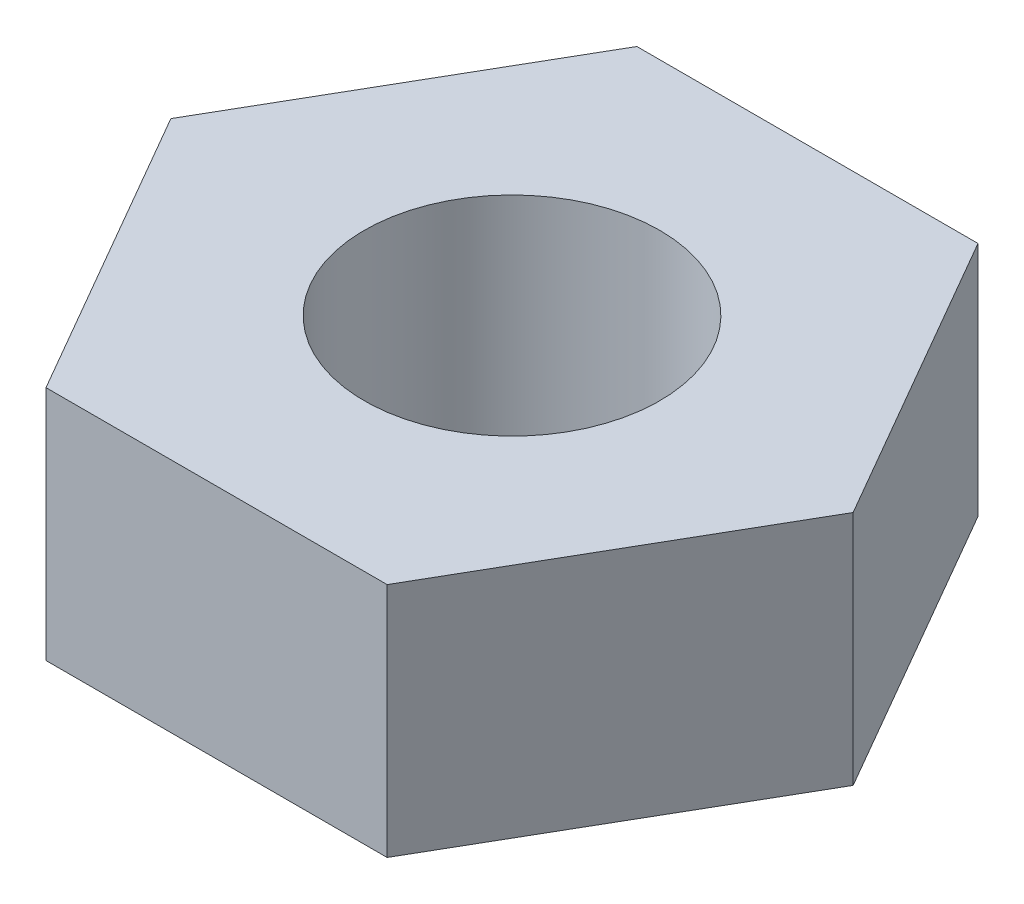
ISO-10303-21;
HEADER;
FILE_DESCRIPTION(('STEP AP214'),'2;1');
FILE_NAME('part.step','',(''),(''),'','','');
FILE_SCHEMA(('AUTOMOTIVE_DESIGN { 1 0 10303 214 1 1 1 1 }'));
ENDSEC;
DATA;
#1=APPLICATION_CONTEXT('core data for automotive mechanical design processes');
#2=APPLICATION_PROTOCOL_DEFINITION('international standard','automotive_design',2000,#1);
#3=PRODUCT_CONTEXT('',#1,'mechanical');
#4=PRODUCT('Part','Part','',(#3));
#5=PRODUCT_RELATED_PRODUCT_CATEGORY('part','',(#4));
#6=PRODUCT_DEFINITION_FORMATION('','',#4);
#7=PRODUCT_DEFINITION_CONTEXT('part definition',#1,'design');
#8=PRODUCT_DEFINITION('design','',#6,#7);
#9=PRODUCT_DEFINITION_SHAPE('','',#8);
#10=(LENGTH_UNIT() NAMED_UNIT(*) SI_UNIT(.MILLI.,.METRE.));
#11=(NAMED_UNIT(*) PLANE_ANGLE_UNIT() SI_UNIT($,.RADIAN.));
#12=(NAMED_UNIT(*) SI_UNIT($,.STERADIAN.) SOLID_ANGLE_UNIT());
#13=UNCERTAINTY_MEASURE_WITH_UNIT(LENGTH_MEASURE(1.E-05),#10,'distance_accuracy_value','');
#14=(GEOMETRIC_REPRESENTATION_CONTEXT(3) GLOBAL_UNCERTAINTY_ASSIGNED_CONTEXT((#13)) GLOBAL_UNIT_ASSIGNED_CONTEXT((#10,
#11,#12)) REPRESENTATION_CONTEXT('',''));
#15=CARTESIAN_POINT('',(0.,0.,0.));
#16=DIRECTION('',(0.,0.,1.));
#17=DIRECTION('',(1.,0.,0.));
#18=AXIS2_PLACEMENT_3D('',#15,#16,#17);
#19=CARTESIAN_POINT('',(1.44337567297407,2.,2.5));
#20=DIRECTION('',(-0.866025403784439,0.,-0.5));
#21=DIRECTION('',(-0.5,0.,0.866025403784439));
#22=AXIS2_PLACEMENT_3D('',#19,#20,#21);
#23=PLANE('',#22);
#24=DIRECTION('',(0.5,0.,-0.866025403784438));
#25=VECTOR('',#24,1.);
#26=CARTESIAN_POINT('',(1.44337567297407,0.,2.5));
#27=LINE('',#26,#25);
#28=CARTESIAN_POINT('',(1.44337567297407,0.,2.5));
#29=VERTEX_POINT('',#28);
#30=CARTESIAN_POINT('',(2.88675134594813,0.,0.));
#31=VERTEX_POINT('',#30);
#32=EDGE_CURVE('E124',#29,#31,#27,.T.);
#33=ORIENTED_EDGE('',*,*,#32,.T.);
#34=DIRECTION('',(0.,-1.,0.));
#35=VECTOR('',#34,1.);
#36=CARTESIAN_POINT('',(2.88675134594813,2.,0.));
#37=LINE('',#36,#35);
#38=CARTESIAN_POINT('',(2.88675134594813,2.,0.));
#39=VERTEX_POINT('',#38);
#40=EDGE_CURVE('E11',#39,#31,#37,.T.);
#41=ORIENTED_EDGE('',*,*,#40,.F.);
#42=DIRECTION('',(0.5,0.,-0.866025403784438));
#43=VECTOR('',#42,1.);
#44=CARTESIAN_POINT('',(1.44337567297407,2.,2.5));
#45=LINE('',#44,#43);
#46=CARTESIAN_POINT('',(1.44337567297407,2.,2.5));
#47=VERTEX_POINT('',#46);
#48=EDGE_CURVE('E135',#47,#39,#45,.T.);
#49=ORIENTED_EDGE('',*,*,#48,.F.);
#50=DIRECTION('',(0.,-1.,0.));
#51=VECTOR('',#50,1.);
#52=CARTESIAN_POINT('',(1.44337567297407,2.,2.5));
#53=LINE('',#52,#51);
#54=EDGE_CURVE('E120',#47,#29,#53,.T.);
#55=ORIENTED_EDGE('',*,*,#54,.T.);
#56=EDGE_LOOP('',(#33,#41,#49,#55));
#57=FACE_BOUND('',#56,.T.);
#58=ADVANCED_FACE('F40',(#57),#23,.F.);
#59=CARTESIAN_POINT('',(2.88675134594813,2.,0.));
#60=DIRECTION('',(-0.866025403784439,0.,0.5));
#61=DIRECTION('',(0.5,0.,0.866025403784439));
#62=AXIS2_PLACEMENT_3D('',#59,#60,#61);
#63=PLANE('',#62);
#64=DIRECTION('',(-0.5,0.,-0.866025403784438));
#65=VECTOR('',#64,1.);
#66=CARTESIAN_POINT('',(2.88675134594813,0.,0.));
#67=LINE('',#66,#65);
#68=CARTESIAN_POINT('',(1.44337567297406,0.,-2.5));
#69=VERTEX_POINT('',#68);
#70=EDGE_CURVE('E127',#31,#69,#67,.T.);
#71=ORIENTED_EDGE('',*,*,#70,.T.);
#72=DIRECTION('',(0.,-1.,0.));
#73=VECTOR('',#72,1.);
#74=CARTESIAN_POINT('',(1.44337567297406,2.,-2.5));
#75=LINE('',#74,#73);
#76=CARTESIAN_POINT('',(1.44337567297406,2.,-2.5));
#77=VERTEX_POINT('',#76);
#78=EDGE_CURVE('E48',#77,#69,#75,.T.);
#79=ORIENTED_EDGE('',*,*,#78,.F.);
#80=DIRECTION('',(-0.5,0.,-0.866025403784438));
#81=VECTOR('',#80,1.);
#82=CARTESIAN_POINT('',(2.88675134594813,2.,0.));
#83=LINE('',#82,#81);
#84=EDGE_CURVE('E93',#39,#77,#83,.T.);
#85=ORIENTED_EDGE('',*,*,#84,.F.);
#86=ORIENTED_EDGE('',*,*,#40,.T.);
#87=EDGE_LOOP('',(#71,#79,#85,#86));
#88=FACE_BOUND('',#87,.T.);
#89=ADVANCED_FACE('F160',(#88),#63,.F.);
#90=CARTESIAN_POINT('',(1.44337567297406,2.,-2.5));
#91=DIRECTION('',(0.,0.,1.));
#92=DIRECTION('',(1.,0.,0.));
#93=AXIS2_PLACEMENT_3D('',#90,#91,#92);
#94=PLANE('',#93);
#95=DIRECTION('',(-1.,0.,0.));
#96=VECTOR('',#95,1.);
#97=CARTESIAN_POINT('',(1.44337567297406,0.,-2.5));
#98=LINE('',#97,#96);
#99=CARTESIAN_POINT('',(-1.44337567297406,0.,-2.5));
#100=VERTEX_POINT('',#99);
#101=EDGE_CURVE('E130',#69,#100,#98,.T.);
#102=ORIENTED_EDGE('',*,*,#101,.T.);
#103=DIRECTION('',(0.,-1.,0.));
#104=VECTOR('',#103,1.);
#105=CARTESIAN_POINT('',(-1.44337567297406,2.,-2.5));
#106=LINE('',#105,#104);
#107=CARTESIAN_POINT('',(-1.44337567297406,2.,-2.5));
#108=VERTEX_POINT('',#107);
#109=EDGE_CURVE('E115',#108,#100,#106,.T.);
#110=ORIENTED_EDGE('',*,*,#109,.F.);
#111=DIRECTION('',(-1.,0.,0.));
#112=VECTOR('',#111,1.);
#113=CARTESIAN_POINT('',(1.44337567297406,2.,-2.5));
#114=LINE('',#113,#112);
#115=EDGE_CURVE('E106',#77,#108,#114,.T.);
#116=ORIENTED_EDGE('',*,*,#115,.F.);
#117=ORIENTED_EDGE('',*,*,#78,.T.);
#118=EDGE_LOOP('',(#102,#110,#116,#117));
#119=FACE_BOUND('',#118,.T.);
#120=ADVANCED_FACE('F141',(#119),#94,.F.);
#121=CARTESIAN_POINT('',(-1.44337567297406,2.,-2.5));
#122=DIRECTION('',(0.866025403784439,0.,0.5));
#123=DIRECTION('',(0.5,0.,-0.866025403784439));
#124=AXIS2_PLACEMENT_3D('',#121,#122,#123);
#125=PLANE('',#124);
#126=DIRECTION('',(-0.5,0.,0.866025403784439));
#127=VECTOR('',#126,1.);
#128=CARTESIAN_POINT('',(-1.44337567297406,0.,-2.5));
#129=LINE('',#128,#127);
#130=CARTESIAN_POINT('',(-2.88675134594813,0.,0.));
#131=VERTEX_POINT('',#130);
#132=EDGE_CURVE('E114',#100,#131,#129,.T.);
#133=ORIENTED_EDGE('',*,*,#132,.T.);
#134=DIRECTION('',(0.,-1.,0.));
#135=VECTOR('',#134,1.);
#136=CARTESIAN_POINT('',(-2.88675134594813,2.,0.));
#137=LINE('',#136,#135);
#138=CARTESIAN_POINT('',(-2.88675134594813,2.,0.));
#139=VERTEX_POINT('',#138);
#140=EDGE_CURVE('E111',#139,#131,#137,.T.);
#141=ORIENTED_EDGE('',*,*,#140,.F.);
#142=DIRECTION('',(-0.5,0.,0.866025403784439));
#143=VECTOR('',#142,1.);
#144=CARTESIAN_POINT('',(-1.44337567297406,2.,-2.5));
#145=LINE('',#144,#143);
#146=EDGE_CURVE('E100',#108,#139,#145,.T.);
#147=ORIENTED_EDGE('',*,*,#146,.F.);
#148=ORIENTED_EDGE('',*,*,#109,.T.);
#149=EDGE_LOOP('',(#133,#141,#147,#148));
#150=FACE_BOUND('',#149,.T.);
#151=ADVANCED_FACE('F112',(#150),#125,.F.);
#152=CARTESIAN_POINT('',(-2.88675134594813,2.,0.));
#153=DIRECTION('',(0.866025403784438,0.,-0.5));
#154=DIRECTION('',(-0.5,0.,-0.866025403784438));
#155=AXIS2_PLACEMENT_3D('',#152,#153,#154);
#156=PLANE('',#155);
#157=DIRECTION('',(0.5,0.,0.866025403784438));
#158=VECTOR('',#157,1.);
#159=CARTESIAN_POINT('',(-2.88675134594813,0.,0.));
#160=LINE('',#159,#158);
#161=CARTESIAN_POINT('',(-1.44337567297406,0.,2.5));
#162=VERTEX_POINT('',#161);
#163=EDGE_CURVE('E79',#131,#162,#160,.T.);
#164=ORIENTED_EDGE('',*,*,#163,.T.);
#165=DIRECTION('',(0.,-1.,0.));
#166=VECTOR('',#165,1.);
#167=CARTESIAN_POINT('',(-1.44337567297406,2.,2.5));
#168=LINE('',#167,#166);
#169=CARTESIAN_POINT('',(-1.44337567297406,2.,2.5));
#170=VERTEX_POINT('',#169);
#171=EDGE_CURVE('E116',#170,#162,#168,.T.);
#172=ORIENTED_EDGE('',*,*,#171,.F.);
#173=DIRECTION('',(0.5,0.,0.866025403784438));
#174=VECTOR('',#173,1.);
#175=CARTESIAN_POINT('',(-2.88675134594813,2.,0.));
#176=LINE('',#175,#174);
#177=EDGE_CURVE('E104',#139,#170,#176,.T.);
#178=ORIENTED_EDGE('',*,*,#177,.F.);
#179=ORIENTED_EDGE('',*,*,#140,.T.);
#180=EDGE_LOOP('',(#164,#172,#178,#179));
#181=FACE_BOUND('',#180,.T.);
#182=ADVANCED_FACE('F118',(#181),#156,.F.);
#183=CARTESIAN_POINT('',(-1.44337567297406,2.,2.5));
#184=DIRECTION('',(0.,0.,-1.));
#185=DIRECTION('',(-1.,0.,0.));
#186=AXIS2_PLACEMENT_3D('',#183,#184,#185);
#187=PLANE('',#186);
#188=DIRECTION('',(1.,0.,0.));
#189=VECTOR('',#188,1.);
#190=CARTESIAN_POINT('',(-1.44337567297406,0.,2.5));
#191=LINE('',#190,#189);
#192=EDGE_CURVE('E85',#162,#29,#191,.T.);
#193=ORIENTED_EDGE('',*,*,#192,.T.);
#194=ORIENTED_EDGE('',*,*,#54,.F.);
#195=DIRECTION('',(1.,0.,0.));
#196=VECTOR('',#195,1.);
#197=CARTESIAN_POINT('',(-1.44337567297406,2.,2.5));
#198=LINE('',#197,#196);
#199=EDGE_CURVE('E56',#170,#47,#198,.T.);
#200=ORIENTED_EDGE('',*,*,#199,.F.);
#201=ORIENTED_EDGE('',*,*,#171,.T.);
#202=EDGE_LOOP('',(#193,#194,#200,#201));
#203=FACE_BOUND('',#202,.T.);
#204=ADVANCED_FACE('F148',(#203),#187,.F.);
#205=CARTESIAN_POINT('',(0.,2.,0.));
#206=DIRECTION('',(0.,1.,0.));
#207=DIRECTION('',(0.,0.,1.));
#208=AXIS2_PLACEMENT_3D('',#205,#206,#207);
#209=PLANE('',#208);
#210=CARTESIAN_POINT('',(0.,2.,0.));
#211=DIRECTION('',(0.,-1.,0.));
#212=DIRECTION('',(0.,0.,-1.));
#213=AXIS2_PLACEMENT_3D('',#210,#211,#212);
#214=CIRCLE('',#213,1.25);
#215=CARTESIAN_POINT('',(0.,2.,-1.25));
#216=VERTEX_POINT('',#215);
#217=EDGE_CURVE('E128',#216,#216,#214,.T.);
#218=ORIENTED_EDGE('',*,*,#217,.T.);
#219=EDGE_LOOP('',(#218));
#220=FACE_BOUND('',#219,.T.);
#221=ORIENTED_EDGE('',*,*,#48,.T.);
#222=ORIENTED_EDGE('',*,*,#84,.T.);
#223=ORIENTED_EDGE('',*,*,#115,.T.);
#224=ORIENTED_EDGE('',*,*,#146,.T.);
#225=ORIENTED_EDGE('',*,*,#177,.T.);
#226=ORIENTED_EDGE('',*,*,#199,.T.);
#227=EDGE_LOOP('',(#221,#222,#223,#224,#225,#226));
#228=FACE_BOUND('',#227,.T.);
#229=ADVANCED_FACE('F102',(#220,#228),#209,.T.);
#230=CARTESIAN_POINT('',(0.,0.,0.));
#231=DIRECTION('',(0.,1.,0.));
#232=DIRECTION('',(0.,0.,1.));
#233=AXIS2_PLACEMENT_3D('',#230,#231,#232);
#234=PLANE('',#233);
#235=CARTESIAN_POINT('',(0.,0.,0.));
#236=DIRECTION('',(0.,-1.,0.));
#237=DIRECTION('',(0.,0.,-1.));
#238=AXIS2_PLACEMENT_3D('',#235,#236,#237);
#239=CIRCLE('',#238,1.25);
#240=CARTESIAN_POINT('',(0.,0.,-1.25));
#241=VERTEX_POINT('',#240);
#242=EDGE_CURVE('E247',#241,#241,#239,.T.);
#243=ORIENTED_EDGE('',*,*,#242,.F.);
#244=EDGE_LOOP('',(#243));
#245=FACE_BOUND('',#244,.T.);
#246=ORIENTED_EDGE('',*,*,#32,.F.);
#247=ORIENTED_EDGE('',*,*,#192,.F.);
#248=ORIENTED_EDGE('',*,*,#163,.F.);
#249=ORIENTED_EDGE('',*,*,#132,.F.);
#250=ORIENTED_EDGE('',*,*,#101,.F.);
#251=ORIENTED_EDGE('',*,*,#70,.F.);
#252=EDGE_LOOP('',(#246,#247,#248,#249,#250,#251));
#253=FACE_BOUND('',#252,.T.);
#254=ADVANCED_FACE('F144',(#245,#253),#234,.F.);
#255=CARTESIAN_POINT('',(0.,2.,0.));
#256=DIRECTION('',(0.,-1.,0.));
#257=DIRECTION('',(0.,0.,-1.));
#258=AXIS2_PLACEMENT_3D('',#255,#256,#257);
#259=CYLINDRICAL_SURFACE('',#258,1.25);
#260=ORIENTED_EDGE('',*,*,#217,.F.);
#261=EDGE_LOOP('',(#260));
#262=FACE_BOUND('',#261,.T.);
#263=ORIENTED_EDGE('',*,*,#242,.T.);
#264=EDGE_LOOP('',(#263));
#265=FACE_BOUND('',#264,.T.);
#266=ADVANCED_FACE('F200',(#262,#265),#259,.F.);
#267=CLOSED_SHELL('',(#58,#89,#120,#151,#182,#204,#229,#254,#266));
#268=MANIFOLD_SOLID_BREP('B2',#267);
#269=ADVANCED_BREP_SHAPE_REPRESENTATION('',(#18,#268),#14);
#270=SHAPE_DEFINITION_REPRESENTATION(#9,#269);
ENDSEC;
END-ISO-10303-21;
